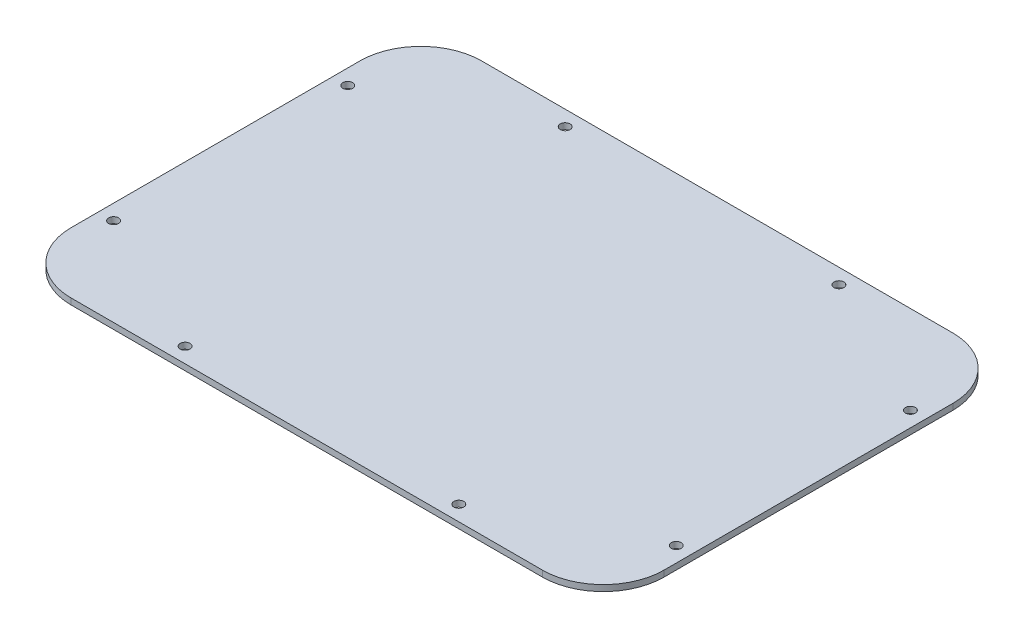
ISO-10303-21;
HEADER;
FILE_DESCRIPTION(('STEP AP214'),'2;1');
FILE_NAME('part.step','',(''),(''),'','','');
FILE_SCHEMA(('AUTOMOTIVE_DESIGN { 1 0 10303 214 1 1 1 1 }'));
ENDSEC;
DATA;
#1=APPLICATION_CONTEXT('core data for automotive mechanical design processes');
#2=APPLICATION_PROTOCOL_DEFINITION('international standard','automotive_design',2000,#1);
#3=PRODUCT_CONTEXT('',#1,'mechanical');
#4=PRODUCT('Part','Part','',(#3));
#5=PRODUCT_RELATED_PRODUCT_CATEGORY('part','',(#4));
#6=PRODUCT_DEFINITION_FORMATION('','',#4);
#7=PRODUCT_DEFINITION_CONTEXT('part definition',#1,'design');
#8=PRODUCT_DEFINITION('design','',#6,#7);
#9=PRODUCT_DEFINITION_SHAPE('','',#8);
#10=(LENGTH_UNIT() NAMED_UNIT(*) SI_UNIT(.MILLI.,.METRE.));
#11=(NAMED_UNIT(*) PLANE_ANGLE_UNIT() SI_UNIT($,.RADIAN.));
#12=(NAMED_UNIT(*) SI_UNIT($,.STERADIAN.) SOLID_ANGLE_UNIT());
#13=UNCERTAINTY_MEASURE_WITH_UNIT(LENGTH_MEASURE(1.E-05),#10,'distance_accuracy_value','');
#14=(GEOMETRIC_REPRESENTATION_CONTEXT(3) GLOBAL_UNCERTAINTY_ASSIGNED_CONTEXT((#13)) GLOBAL_UNIT_ASSIGNED_CONTEXT((#10,
#11,#12)) REPRESENTATION_CONTEXT('',''));
#15=CARTESIAN_POINT('',(0.,0.,0.));
#16=DIRECTION('',(0.,0.,1.));
#17=DIRECTION('',(1.,0.,0.));
#18=AXIS2_PLACEMENT_3D('',#15,#16,#17);
#19=CARTESIAN_POINT('',(195.,4.,-135.));
#20=DIRECTION('',(-1.,0.,0.));
#21=DIRECTION('',(0.,0.,1.));
#22=AXIS2_PLACEMENT_3D('',#19,#20,#21);
#23=PLANE('',#22);
#24=DIRECTION('',(0.,0.,-1.));
#25=VECTOR('',#24,1.);
#26=CARTESIAN_POINT('',(195.,4.,-135.));
#27=LINE('',#26,#25);
#28=CARTESIAN_POINT('',(195.,4.,95.));
#29=VERTEX_POINT('',#28);
#30=CARTESIAN_POINT('',(195.,4.,-95.));
#31=VERTEX_POINT('',#30);
#32=EDGE_CURVE('E129',#29,#31,#27,.T.);
#33=ORIENTED_EDGE('',*,*,#32,.F.);
#34=DIRECTION('',(0.,-1.,0.));
#35=VECTOR('',#34,1.);
#36=CARTESIAN_POINT('',(195.,4.,95.));
#37=LINE('',#36,#35);
#38=CARTESIAN_POINT('',(195.,0.,95.));
#39=VERTEX_POINT('',#38);
#40=EDGE_CURVE('E11',#29,#39,#37,.T.);
#41=ORIENTED_EDGE('',*,*,#40,.T.);
#42=DIRECTION('',(0.,0.,-1.));
#43=VECTOR('',#42,1.);
#44=CARTESIAN_POINT('',(195.,0.,-135.));
#45=LINE('',#44,#43);
#46=CARTESIAN_POINT('',(195.,0.,-95.));
#47=VERTEX_POINT('',#46);
#48=EDGE_CURVE('E131',#39,#47,#45,.T.);
#49=ORIENTED_EDGE('',*,*,#48,.T.);
#50=DIRECTION('',(0.,-1.,0.));
#51=VECTOR('',#50,1.);
#52=CARTESIAN_POINT('',(195.,4.,-95.));
#53=LINE('',#52,#51);
#54=EDGE_CURVE('E42',#47,#31,#53,.F.);
#55=ORIENTED_EDGE('',*,*,#54,.T.);
#56=EDGE_LOOP('',(#33,#41,#49,#55));
#57=FACE_BOUND('',#56,.T.);
#58=ADVANCED_FACE('F34',(#57),#23,.F.);
#59=CARTESIAN_POINT('',(-195.,4.,-135.));
#60=DIRECTION('',(0.,0.,1.));
#61=DIRECTION('',(1.,0.,0.));
#62=AXIS2_PLACEMENT_3D('',#59,#60,#61);
#63=PLANE('',#62);
#64=DIRECTION('',(-1.,0.,0.));
#65=VECTOR('',#64,1.);
#66=CARTESIAN_POINT('',(-195.,0.,-135.));
#67=LINE('',#66,#65);
#68=CARTESIAN_POINT('',(155.,0.,-135.));
#69=VERTEX_POINT('',#68);
#70=CARTESIAN_POINT('',(-155.,0.,-135.));
#71=VERTEX_POINT('',#70);
#72=EDGE_CURVE('E127',#69,#71,#67,.T.);
#73=ORIENTED_EDGE('',*,*,#72,.T.);
#74=DIRECTION('',(0.,-1.,0.));
#75=VECTOR('',#74,1.);
#76=CARTESIAN_POINT('',(-155.,4.,-135.));
#77=LINE('',#76,#75);
#78=CARTESIAN_POINT('',(-155.,4.,-135.));
#79=VERTEX_POINT('',#78);
#80=EDGE_CURVE('E106',#71,#79,#77,.F.);
#81=ORIENTED_EDGE('',*,*,#80,.T.);
#82=DIRECTION('',(-1.,0.,0.));
#83=VECTOR('',#82,1.);
#84=CARTESIAN_POINT('',(-195.,4.,-135.));
#85=LINE('',#84,#83);
#86=CARTESIAN_POINT('',(155.,4.,-135.));
#87=VERTEX_POINT('',#86);
#88=EDGE_CURVE('E167',#87,#79,#85,.T.);
#89=ORIENTED_EDGE('',*,*,#88,.F.);
#90=DIRECTION('',(0.,-1.,0.));
#91=VECTOR('',#90,1.);
#92=CARTESIAN_POINT('',(155.,4.,-135.));
#93=LINE('',#92,#91);
#94=EDGE_CURVE('E111',#87,#69,#93,.T.);
#95=ORIENTED_EDGE('',*,*,#94,.T.);
#96=EDGE_LOOP('',(#73,#81,#89,#95));
#97=FACE_BOUND('',#96,.T.);
#98=ADVANCED_FACE('F171',(#97),#63,.F.);
#99=CARTESIAN_POINT('',(-195.,4.,-135.));
#100=DIRECTION('',(1.,0.,0.));
#101=DIRECTION('',(0.,0.,-1.));
#102=AXIS2_PLACEMENT_3D('',#99,#100,#101);
#103=PLANE('',#102);
#104=DIRECTION('',(0.,0.,1.));
#105=VECTOR('',#104,1.);
#106=CARTESIAN_POINT('',(-195.,4.,-135.));
#107=LINE('',#106,#105);
#108=CARTESIAN_POINT('',(-195.,4.,-95.));
#109=VERTEX_POINT('',#108);
#110=CARTESIAN_POINT('',(-195.,4.,95.));
#111=VERTEX_POINT('',#110);
#112=EDGE_CURVE('E120',#109,#111,#107,.T.);
#113=ORIENTED_EDGE('',*,*,#112,.F.);
#114=DIRECTION('',(0.,-1.,0.));
#115=VECTOR('',#114,1.);
#116=CARTESIAN_POINT('',(-195.,4.,-95.));
#117=LINE('',#116,#115);
#118=CARTESIAN_POINT('',(-195.,0.,-95.));
#119=VERTEX_POINT('',#118);
#120=EDGE_CURVE('E105',#109,#119,#117,.T.);
#121=ORIENTED_EDGE('',*,*,#120,.T.);
#122=DIRECTION('',(0.,0.,1.));
#123=VECTOR('',#122,1.);
#124=CARTESIAN_POINT('',(-195.,0.,-135.));
#125=LINE('',#124,#123);
#126=CARTESIAN_POINT('',(-195.,0.,95.));
#127=VERTEX_POINT('',#126);
#128=EDGE_CURVE('E118',#119,#127,#125,.T.);
#129=ORIENTED_EDGE('',*,*,#128,.T.);
#130=DIRECTION('',(0.,-1.,0.));
#131=VECTOR('',#130,1.);
#132=CARTESIAN_POINT('',(-195.,4.,95.));
#133=LINE('',#132,#131);
#134=EDGE_CURVE('E122',#127,#111,#133,.F.);
#135=ORIENTED_EDGE('',*,*,#134,.T.);
#136=EDGE_LOOP('',(#113,#121,#129,#135));
#137=FACE_BOUND('',#136,.T.);
#138=ADVANCED_FACE('F117',(#137),#103,.F.);
#139=CARTESIAN_POINT('',(-195.,4.,135.));
#140=DIRECTION('',(0.,0.,-1.));
#141=DIRECTION('',(-1.,0.,0.));
#142=AXIS2_PLACEMENT_3D('',#139,#140,#141);
#143=PLANE('',#142);
#144=DIRECTION('',(1.,0.,0.));
#145=VECTOR('',#144,1.);
#146=CARTESIAN_POINT('',(-195.,4.,135.));
#147=LINE('',#146,#145);
#148=CARTESIAN_POINT('',(-155.,4.,135.));
#149=VERTEX_POINT('',#148);
#150=CARTESIAN_POINT('',(155.,4.,135.));
#151=VERTEX_POINT('',#150);
#152=EDGE_CURVE('E135',#149,#151,#147,.T.);
#153=ORIENTED_EDGE('',*,*,#152,.F.);
#154=DIRECTION('',(0.,-1.,0.));
#155=VECTOR('',#154,1.);
#156=CARTESIAN_POINT('',(-155.,4.,135.));
#157=LINE('',#156,#155);
#158=CARTESIAN_POINT('',(-155.,0.,135.));
#159=VERTEX_POINT('',#158);
#160=EDGE_CURVE('E152',#149,#159,#157,.T.);
#161=ORIENTED_EDGE('',*,*,#160,.T.);
#162=DIRECTION('',(1.,0.,0.));
#163=VECTOR('',#162,1.);
#164=CARTESIAN_POINT('',(-195.,0.,135.));
#165=LINE('',#164,#163);
#166=CARTESIAN_POINT('',(155.,0.,135.));
#167=VERTEX_POINT('',#166);
#168=EDGE_CURVE('E126',#159,#167,#165,.T.);
#169=ORIENTED_EDGE('',*,*,#168,.T.);
#170=DIRECTION('',(0.,-1.,0.));
#171=VECTOR('',#170,1.);
#172=CARTESIAN_POINT('',(155.,4.,135.));
#173=LINE('',#172,#171);
#174=EDGE_CURVE('E49',#167,#151,#173,.F.);
#175=ORIENTED_EDGE('',*,*,#174,.T.);
#176=EDGE_LOOP('',(#153,#161,#169,#175));
#177=FACE_BOUND('',#176,.T.);
#178=ADVANCED_FACE('F236',(#177),#143,.F.);
#179=CARTESIAN_POINT('',(0.,4.,0.));
#180=DIRECTION('',(0.,1.,0.));
#181=DIRECTION('',(0.,0.,1.));
#182=AXIS2_PLACEMENT_3D('',#179,#180,#181);
#183=PLANE('',#182);
#184=CARTESIAN_POINT('',(-185.,4.,-77.));
#185=DIRECTION('',(0.,1.,0.));
#186=DIRECTION('',(0.,0.,1.));
#187=AXIS2_PLACEMENT_3D('',#184,#185,#186);
#188=CIRCLE('',#187,3.25000000000001);
#189=CARTESIAN_POINT('',(-185.,4.,-73.75));
#190=VERTEX_POINT('',#189);
#191=EDGE_CURVE('E219',#190,#190,#188,.T.);
#192=ORIENTED_EDGE('',*,*,#191,.F.);
#193=EDGE_LOOP('',(#192));
#194=FACE_BOUND('',#193,.T.);
#195=CARTESIAN_POINT('',(-90.,4.,-125.));
#196=DIRECTION('',(0.,1.,0.));
#197=DIRECTION('',(0.,0.,1.));
#198=AXIS2_PLACEMENT_3D('',#195,#196,#197);
#199=CIRCLE('',#198,3.25000000000001);
#200=CARTESIAN_POINT('',(-90.,4.,-121.75));
#201=VERTEX_POINT('',#200);
#202=EDGE_CURVE('E213',#201,#201,#199,.T.);
#203=ORIENTED_EDGE('',*,*,#202,.F.);
#204=EDGE_LOOP('',(#203));
#205=FACE_BOUND('',#204,.T.);
#206=CARTESIAN_POINT('',(-90.,4.,125.));
#207=DIRECTION('',(0.,1.,0.));
#208=DIRECTION('',(0.,0.,1.));
#209=AXIS2_PLACEMENT_3D('',#206,#207,#208);
#210=CIRCLE('',#209,3.25000000000001);
#211=CARTESIAN_POINT('',(-90.,4.,128.25));
#212=VERTEX_POINT('',#211);
#213=EDGE_CURVE('E207',#212,#212,#210,.T.);
#214=ORIENTED_EDGE('',*,*,#213,.F.);
#215=EDGE_LOOP('',(#214));
#216=FACE_BOUND('',#215,.T.);
#217=CARTESIAN_POINT('',(90.,4.,125.));
#218=DIRECTION('',(0.,1.,0.));
#219=DIRECTION('',(0.,0.,1.));
#220=AXIS2_PLACEMENT_3D('',#217,#218,#219);
#221=CIRCLE('',#220,3.25000000000001);
#222=CARTESIAN_POINT('',(90.,4.,128.25));
#223=VERTEX_POINT('',#222);
#224=EDGE_CURVE('E201',#223,#223,#221,.T.);
#225=ORIENTED_EDGE('',*,*,#224,.F.);
#226=EDGE_LOOP('',(#225));
#227=FACE_BOUND('',#226,.T.);
#228=CARTESIAN_POINT('',(185.,4.,77.));
#229=DIRECTION('',(0.,1.,0.));
#230=DIRECTION('',(0.,0.,1.));
#231=AXIS2_PLACEMENT_3D('',#228,#229,#230);
#232=CIRCLE('',#231,3.25000000000001);
#233=CARTESIAN_POINT('',(185.,4.,80.25));
#234=VERTEX_POINT('',#233);
#235=EDGE_CURVE('E195',#234,#234,#232,.T.);
#236=ORIENTED_EDGE('',*,*,#235,.F.);
#237=EDGE_LOOP('',(#236));
#238=FACE_BOUND('',#237,.T.);
#239=CARTESIAN_POINT('',(185.,4.,-77.));
#240=DIRECTION('',(0.,1.,0.));
#241=DIRECTION('',(0.,0.,1.));
#242=AXIS2_PLACEMENT_3D('',#239,#240,#241);
#243=CIRCLE('',#242,3.25000000000001);
#244=CARTESIAN_POINT('',(185.,4.,-73.75));
#245=VERTEX_POINT('',#244);
#246=EDGE_CURVE('E189',#245,#245,#243,.T.);
#247=ORIENTED_EDGE('',*,*,#246,.F.);
#248=EDGE_LOOP('',(#247));
#249=FACE_BOUND('',#248,.T.);
#250=CARTESIAN_POINT('',(90.,4.,-125.));
#251=DIRECTION('',(0.,1.,0.));
#252=DIRECTION('',(0.,0.,1.));
#253=AXIS2_PLACEMENT_3D('',#250,#251,#252);
#254=CIRCLE('',#253,3.25000000000001);
#255=CARTESIAN_POINT('',(90.,4.,-121.75));
#256=VERTEX_POINT('',#255);
#257=EDGE_CURVE('E183',#256,#256,#254,.T.);
#258=ORIENTED_EDGE('',*,*,#257,.F.);
#259=EDGE_LOOP('',(#258));
#260=FACE_BOUND('',#259,.T.);
#261=CARTESIAN_POINT('',(-185.,4.,77.));
#262=DIRECTION('',(0.,1.,0.));
#263=DIRECTION('',(0.,0.,1.));
#264=AXIS2_PLACEMENT_3D('',#261,#262,#263);
#265=CIRCLE('',#264,3.25000000000001);
#266=CARTESIAN_POINT('',(-185.,4.,80.25));
#267=VERTEX_POINT('',#266);
#268=EDGE_CURVE('E174',#267,#267,#265,.T.);
#269=ORIENTED_EDGE('',*,*,#268,.F.);
#270=EDGE_LOOP('',(#269));
#271=FACE_BOUND('',#270,.T.);
#272=ORIENTED_EDGE('',*,*,#88,.T.);
#273=CARTESIAN_POINT('',(-155.,4.,-95.));
#274=DIRECTION('',(0.,1.,0.));
#275=DIRECTION('',(0.,0.,1.));
#276=AXIS2_PLACEMENT_3D('',#273,#274,#275);
#277=CIRCLE('',#276,40.);
#278=EDGE_CURVE('E149',#79,#109,#277,.T.);
#279=ORIENTED_EDGE('',*,*,#278,.T.);
#280=ORIENTED_EDGE('',*,*,#112,.T.);
#281=CARTESIAN_POINT('',(-155.,4.,95.));
#282=DIRECTION('',(0.,1.,0.));
#283=DIRECTION('',(0.,0.,1.));
#284=AXIS2_PLACEMENT_3D('',#281,#282,#283);
#285=CIRCLE('',#284,40.);
#286=EDGE_CURVE('E56',#111,#149,#285,.T.);
#287=ORIENTED_EDGE('',*,*,#286,.T.);
#288=ORIENTED_EDGE('',*,*,#152,.T.);
#289=CARTESIAN_POINT('',(155.,4.,95.));
#290=DIRECTION('',(0.,1.,0.));
#291=DIRECTION('',(0.,0.,1.));
#292=AXIS2_PLACEMENT_3D('',#289,#290,#291);
#293=CIRCLE('',#292,40.);
#294=EDGE_CURVE('E146',#151,#29,#293,.T.);
#295=ORIENTED_EDGE('',*,*,#294,.T.);
#296=ORIENTED_EDGE('',*,*,#32,.T.);
#297=CARTESIAN_POINT('',(155.,4.,-95.));
#298=DIRECTION('',(0.,1.,0.));
#299=DIRECTION('',(0.,0.,1.));
#300=AXIS2_PLACEMENT_3D('',#297,#298,#299);
#301=CIRCLE('',#300,40.);
#302=EDGE_CURVE('E144',#31,#87,#301,.T.);
#303=ORIENTED_EDGE('',*,*,#302,.T.);
#304=EDGE_LOOP('',(#272,#279,#280,#287,#288,#295,#296,#303));
#305=FACE_BOUND('',#304,.T.);
#306=ADVANCED_FACE('F164',(#194,#205,#216,#227,#238,#249,#260,#271,#305),#183,.T.);
#307=CARTESIAN_POINT('',(0.,0.,0.));
#308=DIRECTION('',(0.,1.,0.));
#309=DIRECTION('',(0.,0.,1.));
#310=AXIS2_PLACEMENT_3D('',#307,#308,#309);
#311=PLANE('',#310);
#312=CARTESIAN_POINT('',(-185.,0.,-77.));
#313=DIRECTION('',(0.,1.,0.));
#314=DIRECTION('',(0.,0.,1.));
#315=AXIS2_PLACEMENT_3D('',#312,#313,#314);
#316=CIRCLE('',#315,3.25000000000001);
#317=CARTESIAN_POINT('',(-185.,0.,-73.75));
#318=VERTEX_POINT('',#317);
#319=EDGE_CURVE('E181',#318,#318,#316,.T.);
#320=ORIENTED_EDGE('',*,*,#319,.T.);
#321=EDGE_LOOP('',(#320));
#322=FACE_BOUND('',#321,.T.);
#323=CARTESIAN_POINT('',(-90.,0.,-125.));
#324=DIRECTION('',(0.,1.,0.));
#325=DIRECTION('',(0.,0.,1.));
#326=AXIS2_PLACEMENT_3D('',#323,#324,#325);
#327=CIRCLE('',#326,3.25000000000001);
#328=CARTESIAN_POINT('',(-90.,0.,-121.75));
#329=VERTEX_POINT('',#328);
#330=EDGE_CURVE('E216',#329,#329,#327,.T.);
#331=ORIENTED_EDGE('',*,*,#330,.T.);
#332=EDGE_LOOP('',(#331));
#333=FACE_BOUND('',#332,.T.);
#334=CARTESIAN_POINT('',(-90.,0.,125.));
#335=DIRECTION('',(0.,1.,0.));
#336=DIRECTION('',(0.,0.,1.));
#337=AXIS2_PLACEMENT_3D('',#334,#335,#336);
#338=CIRCLE('',#337,3.25000000000001);
#339=CARTESIAN_POINT('',(-90.,0.,128.25));
#340=VERTEX_POINT('',#339);
#341=EDGE_CURVE('E210',#340,#340,#338,.T.);
#342=ORIENTED_EDGE('',*,*,#341,.T.);
#343=EDGE_LOOP('',(#342));
#344=FACE_BOUND('',#343,.T.);
#345=CARTESIAN_POINT('',(90.,0.,125.));
#346=DIRECTION('',(0.,1.,0.));
#347=DIRECTION('',(0.,0.,1.));
#348=AXIS2_PLACEMENT_3D('',#345,#346,#347);
#349=CIRCLE('',#348,3.25000000000001);
#350=CARTESIAN_POINT('',(90.,0.,128.25));
#351=VERTEX_POINT('',#350);
#352=EDGE_CURVE('E204',#351,#351,#349,.T.);
#353=ORIENTED_EDGE('',*,*,#352,.T.);
#354=EDGE_LOOP('',(#353));
#355=FACE_BOUND('',#354,.T.);
#356=CARTESIAN_POINT('',(185.,0.,77.));
#357=DIRECTION('',(0.,1.,0.));
#358=DIRECTION('',(0.,0.,1.));
#359=AXIS2_PLACEMENT_3D('',#356,#357,#358);
#360=CIRCLE('',#359,3.25000000000001);
#361=CARTESIAN_POINT('',(185.,0.,80.25));
#362=VERTEX_POINT('',#361);
#363=EDGE_CURVE('E198',#362,#362,#360,.T.);
#364=ORIENTED_EDGE('',*,*,#363,.T.);
#365=EDGE_LOOP('',(#364));
#366=FACE_BOUND('',#365,.T.);
#367=CARTESIAN_POINT('',(185.,0.,-77.));
#368=DIRECTION('',(0.,1.,0.));
#369=DIRECTION('',(0.,0.,1.));
#370=AXIS2_PLACEMENT_3D('',#367,#368,#369);
#371=CIRCLE('',#370,3.25000000000001);
#372=CARTESIAN_POINT('',(185.,0.,-73.75));
#373=VERTEX_POINT('',#372);
#374=EDGE_CURVE('E192',#373,#373,#371,.T.);
#375=ORIENTED_EDGE('',*,*,#374,.T.);
#376=EDGE_LOOP('',(#375));
#377=FACE_BOUND('',#376,.T.);
#378=CARTESIAN_POINT('',(90.,0.,-125.));
#379=DIRECTION('',(0.,1.,0.));
#380=DIRECTION('',(0.,0.,1.));
#381=AXIS2_PLACEMENT_3D('',#378,#379,#380);
#382=CIRCLE('',#381,3.25000000000001);
#383=CARTESIAN_POINT('',(90.,0.,-121.75));
#384=VERTEX_POINT('',#383);
#385=EDGE_CURVE('E186',#384,#384,#382,.T.);
#386=ORIENTED_EDGE('',*,*,#385,.T.);
#387=EDGE_LOOP('',(#386));
#388=FACE_BOUND('',#387,.T.);
#389=CARTESIAN_POINT('',(-185.,0.,77.));
#390=DIRECTION('',(0.,1.,0.));
#391=DIRECTION('',(0.,0.,1.));
#392=AXIS2_PLACEMENT_3D('',#389,#390,#391);
#393=CIRCLE('',#392,3.25000000000001);
#394=CARTESIAN_POINT('',(-185.,0.,80.25));
#395=VERTEX_POINT('',#394);
#396=EDGE_CURVE('E172',#395,#395,#393,.T.);
#397=ORIENTED_EDGE('',*,*,#396,.T.);
#398=EDGE_LOOP('',(#397));
#399=FACE_BOUND('',#398,.T.);
#400=ORIENTED_EDGE('',*,*,#128,.F.);
#401=CARTESIAN_POINT('',(-155.,0.,-95.));
#402=DIRECTION('',(0.,1.,0.));
#403=DIRECTION('',(0.,0.,1.));
#404=AXIS2_PLACEMENT_3D('',#401,#402,#403);
#405=CIRCLE('',#404,40.);
#406=EDGE_CURVE('E101',#119,#71,#405,.F.);
#407=ORIENTED_EDGE('',*,*,#406,.T.);
#408=ORIENTED_EDGE('',*,*,#72,.F.);
#409=CARTESIAN_POINT('',(155.,0.,-95.));
#410=DIRECTION('',(0.,1.,0.));
#411=DIRECTION('',(0.,0.,1.));
#412=AXIS2_PLACEMENT_3D('',#409,#410,#411);
#413=CIRCLE('',#412,40.);
#414=EDGE_CURVE('E121',#69,#47,#413,.F.);
#415=ORIENTED_EDGE('',*,*,#414,.T.);
#416=ORIENTED_EDGE('',*,*,#48,.F.);
#417=CARTESIAN_POINT('',(155.,0.,95.));
#418=DIRECTION('',(0.,1.,0.));
#419=DIRECTION('',(0.,0.,1.));
#420=AXIS2_PLACEMENT_3D('',#417,#418,#419);
#421=CIRCLE('',#420,40.);
#422=EDGE_CURVE('E138',#39,#167,#421,.F.);
#423=ORIENTED_EDGE('',*,*,#422,.T.);
#424=ORIENTED_EDGE('',*,*,#168,.F.);
#425=CARTESIAN_POINT('',(-155.,0.,95.));
#426=DIRECTION('',(0.,1.,0.));
#427=DIRECTION('',(0.,0.,1.));
#428=AXIS2_PLACEMENT_3D('',#425,#426,#427);
#429=CIRCLE('',#428,40.);
#430=EDGE_CURVE('E112',#159,#127,#429,.F.);
#431=ORIENTED_EDGE('',*,*,#430,.T.);
#432=EDGE_LOOP('',(#400,#407,#408,#415,#416,#423,#424,#431));
#433=FACE_BOUND('',#432,.T.);
#434=ADVANCED_FACE('F124',(#322,#333,#344,#355,#366,#377,#388,#399,#433),#311,.F.);
#435=CARTESIAN_POINT('',(-155.,4.,-95.));
#436=DIRECTION('',(0.,-1.,0.));
#437=DIRECTION('',(0.,0.,-1.));
#438=AXIS2_PLACEMENT_3D('',#435,#436,#437);
#439=CYLINDRICAL_SURFACE('',#438,40.);
#440=ORIENTED_EDGE('',*,*,#278,.F.);
#441=ORIENTED_EDGE('',*,*,#80,.F.);
#442=ORIENTED_EDGE('',*,*,#406,.F.);
#443=ORIENTED_EDGE('',*,*,#120,.F.);
#444=EDGE_LOOP('',(#440,#441,#442,#443));
#445=FACE_BOUND('',#444,.T.);
#446=ADVANCED_FACE('F104',(#445),#439,.T.);
#447=CARTESIAN_POINT('',(-155.,4.,95.));
#448=DIRECTION('',(0.,-1.,0.));
#449=DIRECTION('',(0.,0.,-1.));
#450=AXIS2_PLACEMENT_3D('',#447,#448,#449);
#451=CYLINDRICAL_SURFACE('',#450,40.);
#452=ORIENTED_EDGE('',*,*,#286,.F.);
#453=ORIENTED_EDGE('',*,*,#134,.F.);
#454=ORIENTED_EDGE('',*,*,#430,.F.);
#455=ORIENTED_EDGE('',*,*,#160,.F.);
#456=EDGE_LOOP('',(#452,#453,#454,#455));
#457=FACE_BOUND('',#456,.T.);
#458=ADVANCED_FACE('F276',(#457),#451,.T.);
#459=CARTESIAN_POINT('',(155.,4.,95.));
#460=DIRECTION('',(0.,-1.,0.));
#461=DIRECTION('',(0.,0.,-1.));
#462=AXIS2_PLACEMENT_3D('',#459,#460,#461);
#463=CYLINDRICAL_SURFACE('',#462,40.);
#464=ORIENTED_EDGE('',*,*,#294,.F.);
#465=ORIENTED_EDGE('',*,*,#174,.F.);
#466=ORIENTED_EDGE('',*,*,#422,.F.);
#467=ORIENTED_EDGE('',*,*,#40,.F.);
#468=EDGE_LOOP('',(#464,#465,#466,#467));
#469=FACE_BOUND('',#468,.T.);
#470=ADVANCED_FACE('F264',(#469),#463,.T.);
#471=CARTESIAN_POINT('',(155.,4.,-95.));
#472=DIRECTION('',(0.,-1.,0.));
#473=DIRECTION('',(0.,0.,-1.));
#474=AXIS2_PLACEMENT_3D('',#471,#472,#473);
#475=CYLINDRICAL_SURFACE('',#474,40.);
#476=ORIENTED_EDGE('',*,*,#302,.F.);
#477=ORIENTED_EDGE('',*,*,#54,.F.);
#478=ORIENTED_EDGE('',*,*,#414,.F.);
#479=ORIENTED_EDGE('',*,*,#94,.F.);
#480=EDGE_LOOP('',(#476,#477,#478,#479));
#481=FACE_BOUND('',#480,.T.);
#482=ADVANCED_FACE('F36',(#481),#475,.T.);
#483=CARTESIAN_POINT('',(-185.,0.,77.));
#484=DIRECTION('',(0.,1.,0.));
#485=DIRECTION('',(0.,0.,1.));
#486=AXIS2_PLACEMENT_3D('',#483,#484,#485);
#487=CYLINDRICAL_SURFACE('',#486,3.25000000000001);
#488=ORIENTED_EDGE('',*,*,#396,.F.);
#489=EDGE_LOOP('',(#488));
#490=FACE_BOUND('',#489,.T.);
#491=ORIENTED_EDGE('',*,*,#268,.T.);
#492=EDGE_LOOP('',(#491));
#493=FACE_BOUND('',#492,.T.);
#494=ADVANCED_FACE('F252',(#490,#493),#487,.F.);
#495=CARTESIAN_POINT('',(90.,0.,-125.));
#496=DIRECTION('',(0.,1.,0.));
#497=DIRECTION('',(0.,0.,1.));
#498=AXIS2_PLACEMENT_3D('',#495,#496,#497);
#499=CYLINDRICAL_SURFACE('',#498,3.25000000000001);
#500=ORIENTED_EDGE('',*,*,#385,.F.);
#501=EDGE_LOOP('',(#500));
#502=FACE_BOUND('',#501,.T.);
#503=ORIENTED_EDGE('',*,*,#257,.T.);
#504=EDGE_LOOP('',(#503));
#505=FACE_BOUND('',#504,.T.);
#506=ADVANCED_FACE('F254',(#502,#505),#499,.F.);
#507=CARTESIAN_POINT('',(185.,0.,-77.));
#508=DIRECTION('',(0.,1.,0.));
#509=DIRECTION('',(0.,0.,1.));
#510=AXIS2_PLACEMENT_3D('',#507,#508,#509);
#511=CYLINDRICAL_SURFACE('',#510,3.25000000000001);
#512=ORIENTED_EDGE('',*,*,#374,.F.);
#513=EDGE_LOOP('',(#512));
#514=FACE_BOUND('',#513,.T.);
#515=ORIENTED_EDGE('',*,*,#246,.T.);
#516=EDGE_LOOP('',(#515));
#517=FACE_BOUND('',#516,.T.);
#518=ADVANCED_FACE('F261',(#514,#517),#511,.F.);
#519=CARTESIAN_POINT('',(185.,0.,77.));
#520=DIRECTION('',(0.,1.,0.));
#521=DIRECTION('',(0.,0.,1.));
#522=AXIS2_PLACEMENT_3D('',#519,#520,#521);
#523=CYLINDRICAL_SURFACE('',#522,3.25000000000001);
#524=ORIENTED_EDGE('',*,*,#363,.F.);
#525=EDGE_LOOP('',(#524));
#526=FACE_BOUND('',#525,.T.);
#527=ORIENTED_EDGE('',*,*,#235,.T.);
#528=EDGE_LOOP('',(#527));
#529=FACE_BOUND('',#528,.T.);
#530=ADVANCED_FACE('F319',(#526,#529),#523,.F.);
#531=CARTESIAN_POINT('',(90.,0.,125.));
#532=DIRECTION('',(0.,1.,0.));
#533=DIRECTION('',(0.,0.,1.));
#534=AXIS2_PLACEMENT_3D('',#531,#532,#533);
#535=CYLINDRICAL_SURFACE('',#534,3.25000000000001);
#536=ORIENTED_EDGE('',*,*,#352,.F.);
#537=EDGE_LOOP('',(#536));
#538=FACE_BOUND('',#537,.T.);
#539=ORIENTED_EDGE('',*,*,#224,.T.);
#540=EDGE_LOOP('',(#539));
#541=FACE_BOUND('',#540,.T.);
#542=ADVANCED_FACE('F329',(#538,#541),#535,.F.);
#543=CARTESIAN_POINT('',(-90.,0.,125.));
#544=DIRECTION('',(0.,1.,0.));
#545=DIRECTION('',(0.,0.,1.));
#546=AXIS2_PLACEMENT_3D('',#543,#544,#545);
#547=CYLINDRICAL_SURFACE('',#546,3.25000000000001);
#548=ORIENTED_EDGE('',*,*,#341,.F.);
#549=EDGE_LOOP('',(#548));
#550=FACE_BOUND('',#549,.T.);
#551=ORIENTED_EDGE('',*,*,#213,.T.);
#552=EDGE_LOOP('',(#551));
#553=FACE_BOUND('',#552,.T.);
#554=ADVANCED_FACE('F339',(#550,#553),#547,.F.);
#555=CARTESIAN_POINT('',(-90.,0.,-125.));
#556=DIRECTION('',(0.,1.,0.));
#557=DIRECTION('',(0.,0.,1.));
#558=AXIS2_PLACEMENT_3D('',#555,#556,#557);
#559=CYLINDRICAL_SURFACE('',#558,3.25000000000001);
#560=ORIENTED_EDGE('',*,*,#330,.F.);
#561=EDGE_LOOP('',(#560));
#562=FACE_BOUND('',#561,.T.);
#563=ORIENTED_EDGE('',*,*,#202,.T.);
#564=EDGE_LOOP('',(#563));
#565=FACE_BOUND('',#564,.T.);
#566=ADVANCED_FACE('F230',(#562,#565),#559,.F.);
#567=CARTESIAN_POINT('',(-185.,0.,-77.));
#568=DIRECTION('',(0.,1.,0.));
#569=DIRECTION('',(0.,0.,1.));
#570=AXIS2_PLACEMENT_3D('',#567,#568,#569);
#571=CYLINDRICAL_SURFACE('',#570,3.25000000000001);
#572=ORIENTED_EDGE('',*,*,#319,.F.);
#573=EDGE_LOOP('',(#572));
#574=FACE_BOUND('',#573,.T.);
#575=ORIENTED_EDGE('',*,*,#191,.T.);
#576=EDGE_LOOP('',(#575));
#577=FACE_BOUND('',#576,.T.);
#578=ADVANCED_FACE('F227',(#574,#577),#571,.F.);
#579=CLOSED_SHELL('',(#58,#98,#138,#178,#306,#434,#446,#458,#470,#482,#494,#506,#518,#530,#542,
#554,#566,#578));
#580=MANIFOLD_SOLID_BREP('B2',#579);
#581=ADVANCED_BREP_SHAPE_REPRESENTATION('',(#18,#580),#14);
#582=SHAPE_DEFINITION_REPRESENTATION(#9,#581);
ENDSEC;
END-ISO-10303-21;
